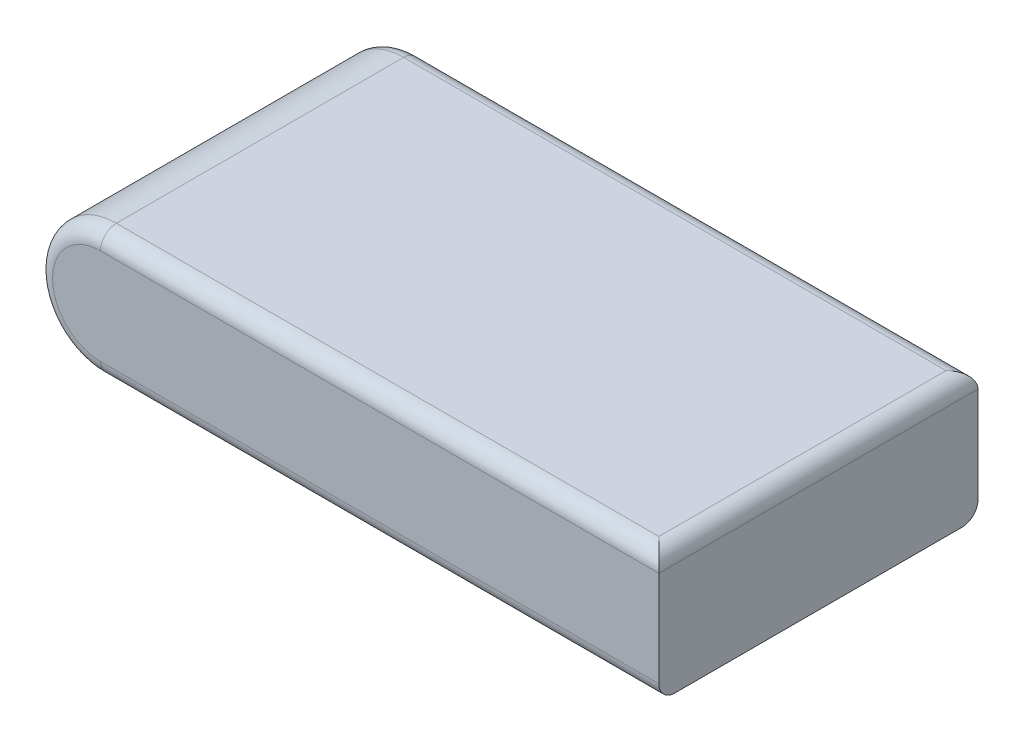
ISO-10303-21;
HEADER;
FILE_DESCRIPTION(('STEP AP214'),'2;1');
FILE_NAME('part.step','',(''),(''),'','','');
FILE_SCHEMA(('AUTOMOTIVE_DESIGN { 1 0 10303 214 1 1 1 1 }'));
ENDSEC;
DATA;
#1=APPLICATION_CONTEXT('core data for automotive mechanical design processes');
#2=APPLICATION_PROTOCOL_DEFINITION('international standard','automotive_design',2000,#1);
#3=PRODUCT_CONTEXT('',#1,'mechanical');
#4=PRODUCT('Part','Part','',(#3));
#5=PRODUCT_RELATED_PRODUCT_CATEGORY('part','',(#4));
#6=PRODUCT_DEFINITION_FORMATION('','',#4);
#7=PRODUCT_DEFINITION_CONTEXT('part definition',#1,'design');
#8=PRODUCT_DEFINITION('design','',#6,#7);
#9=PRODUCT_DEFINITION_SHAPE('','',#8);
#10=(LENGTH_UNIT() NAMED_UNIT(*) SI_UNIT(.MILLI.,.METRE.));
#11=(NAMED_UNIT(*) PLANE_ANGLE_UNIT() SI_UNIT($,.RADIAN.));
#12=(NAMED_UNIT(*) SI_UNIT($,.STERADIAN.) SOLID_ANGLE_UNIT());
#13=UNCERTAINTY_MEASURE_WITH_UNIT(LENGTH_MEASURE(1.E-05),#10,'distance_accuracy_value','');
#14=(GEOMETRIC_REPRESENTATION_CONTEXT(3) GLOBAL_UNCERTAINTY_ASSIGNED_CONTEXT((#13)) GLOBAL_UNIT_ASSIGNED_CONTEXT((#10,
#11,#12)) REPRESENTATION_CONTEXT('',''));
#15=CARTESIAN_POINT('',(0.,0.,0.));
#16=DIRECTION('',(0.,0.,1.));
#17=DIRECTION('',(1.,0.,0.));
#18=AXIS2_PLACEMENT_3D('',#15,#16,#17);
#19=CARTESIAN_POINT('',(-17.5,0.,20.));
#20=DIRECTION('',(0.,0.,-1.));
#21=DIRECTION('',(-1.,0.,0.));
#22=AXIS2_PLACEMENT_3D('',#19,#20,#21);
#23=CYLINDRICAL_SURFACE('',#22,4.);
#24=DIRECTION('',(0.,0.,-1.));
#25=VECTOR('',#24,1.);
#26=CARTESIAN_POINT('',(-17.5,-4.00000000000001,20.));
#27=LINE('',#26,#25);
#28=CARTESIAN_POINT('',(-17.5,-4.00000000000001,19.));
#29=VERTEX_POINT('',#28);
#30=CARTESIAN_POINT('',(-17.5,-4.00000000000001,1.));
#31=VERTEX_POINT('',#30);
#32=EDGE_CURVE('E132',#29,#31,#27,.T.);
#33=ORIENTED_EDGE('',*,*,#32,.F.);
#34=CARTESIAN_POINT('',(-17.5,0.,19.));
#35=DIRECTION('',(0.,0.,-1.));
#36=DIRECTION('',(-1.,0.,0.));
#37=AXIS2_PLACEMENT_3D('',#34,#35,#36);
#38=CIRCLE('',#37,4.);
#39=CARTESIAN_POINT('',(-17.5,3.99999999999999,19.));
#40=VERTEX_POINT('',#39);
#41=EDGE_CURVE('E144',#29,#40,#38,.T.);
#42=ORIENTED_EDGE('',*,*,#41,.T.);
#43=DIRECTION('',(0.,0.,-1.));
#44=VECTOR('',#43,1.);
#45=CARTESIAN_POINT('',(-17.5,3.99999999999999,20.));
#46=LINE('',#45,#44);
#47=CARTESIAN_POINT('',(-17.5,3.99999999999999,1.));
#48=VERTEX_POINT('',#47);
#49=EDGE_CURVE('E123',#40,#48,#46,.T.);
#50=ORIENTED_EDGE('',*,*,#49,.T.);
#51=CARTESIAN_POINT('',(-17.5,0.,1.));
#52=DIRECTION('',(0.,0.,-1.));
#53=DIRECTION('',(-1.,0.,0.));
#54=AXIS2_PLACEMENT_3D('',#51,#52,#53);
#55=CIRCLE('',#54,4.);
#56=EDGE_CURVE('E142',#48,#31,#55,.F.);
#57=ORIENTED_EDGE('',*,*,#56,.T.);
#58=EDGE_LOOP('',(#33,#42,#50,#57));
#59=FACE_BOUND('',#58,.T.);
#60=ADVANCED_FACE('F34',(#59),#23,.T.);
#61=CARTESIAN_POINT('',(17.5,-4.,20.));
#62=DIRECTION('',(0.,1.,0.));
#63=DIRECTION('',(-1.,0.,0.));
#64=AXIS2_PLACEMENT_3D('',#61,#62,#63);
#65=PLANE('',#64);
#66=DIRECTION('',(0.,0.,-1.));
#67=VECTOR('',#66,1.);
#68=CARTESIAN_POINT('',(17.5,-4.,20.));
#69=LINE('',#68,#67);
#70=CARTESIAN_POINT('',(17.5,-4.,19.));
#71=VERTEX_POINT('',#70);
#72=CARTESIAN_POINT('',(17.5,-4.,1.));
#73=VERTEX_POINT('',#72);
#74=EDGE_CURVE('E127',#71,#73,#69,.T.);
#75=ORIENTED_EDGE('',*,*,#74,.F.);
#76=DIRECTION('',(1.,0.,0.));
#77=VECTOR('',#76,1.);
#78=CARTESIAN_POINT('',(17.5,-4.,19.));
#79=LINE('',#78,#77);
#80=EDGE_CURVE('E102',#71,#29,#79,.F.);
#81=ORIENTED_EDGE('',*,*,#80,.T.);
#82=ORIENTED_EDGE('',*,*,#32,.T.);
#83=DIRECTION('',(1.,0.,0.));
#84=VECTOR('',#83,1.);
#85=CARTESIAN_POINT('',(17.5,-4.,1.));
#86=LINE('',#85,#84);
#87=EDGE_CURVE('E107',#31,#73,#86,.T.);
#88=ORIENTED_EDGE('',*,*,#87,.T.);
#89=EDGE_LOOP('',(#75,#81,#82,#88));
#90=FACE_BOUND('',#89,.T.);
#91=ADVANCED_FACE('F181',(#90),#65,.F.);
#92=CARTESIAN_POINT('',(17.5,-4.,20.));
#93=DIRECTION('',(-1.,0.,0.));
#94=DIRECTION('',(0.,0.,1.));
#95=AXIS2_PLACEMENT_3D('',#92,#93,#94);
#96=PLANE('',#95);
#97=DIRECTION('',(0.,1.,0.));
#98=VECTOR('',#97,1.);
#99=CARTESIAN_POINT('',(17.5,-4.,20.));
#100=LINE('',#99,#98);
#101=CARTESIAN_POINT('',(17.5,-3.,20.));
#102=VERTEX_POINT('',#101);
#103=CARTESIAN_POINT('',(17.5,3.,20.));
#104=VERTEX_POINT('',#103);
#105=EDGE_CURVE('E113',#102,#104,#100,.T.);
#106=ORIENTED_EDGE('',*,*,#105,.F.);
#107=CARTESIAN_POINT('',(17.5,-3.,19.));
#108=DIRECTION('',(-1.,0.,0.));
#109=DIRECTION('',(0.,0.,1.));
#110=AXIS2_PLACEMENT_3D('',#107,#108,#109);
#111=CIRCLE('',#110,1.);
#112=EDGE_CURVE('E97',#102,#71,#111,.F.);
#113=ORIENTED_EDGE('',*,*,#112,.T.);
#114=ORIENTED_EDGE('',*,*,#74,.T.);
#115=CARTESIAN_POINT('',(17.5,-3.,1.));
#116=DIRECTION('',(-1.,0.,0.));
#117=DIRECTION('',(0.,0.,1.));
#118=AXIS2_PLACEMENT_3D('',#115,#116,#117);
#119=CIRCLE('',#118,1.);
#120=CARTESIAN_POINT('',(17.5,-3.,0.));
#121=VERTEX_POINT('',#120);
#122=EDGE_CURVE('E108',#73,#121,#119,.F.);
#123=ORIENTED_EDGE('',*,*,#122,.T.);
#124=DIRECTION('',(0.,1.,0.));
#125=VECTOR('',#124,1.);
#126=CARTESIAN_POINT('',(17.5,-4.,0.));
#127=LINE('',#126,#125);
#128=CARTESIAN_POINT('',(17.5,3.,0.));
#129=VERTEX_POINT('',#128);
#130=EDGE_CURVE('E124',#121,#129,#127,.T.);
#131=ORIENTED_EDGE('',*,*,#130,.T.);
#132=DIRECTION('',(0.,0.,-1.));
#133=VECTOR('',#132,1.);
#134=CARTESIAN_POINT('',(17.5,3.,20.));
#135=LINE('',#134,#133);
#136=EDGE_CURVE('E118',#129,#104,#135,.F.);
#137=ORIENTED_EDGE('',*,*,#136,.T.);
#138=EDGE_LOOP('',(#106,#113,#114,#123,#131,#137));
#139=FACE_BOUND('',#138,.T.);
#140=ADVANCED_FACE('F120',(#139),#96,.F.);
#141=CARTESIAN_POINT('',(17.5,4.,20.));
#142=DIRECTION('',(0.,-1.,0.));
#143=DIRECTION('',(1.,0.,0.));
#144=AXIS2_PLACEMENT_3D('',#141,#142,#143);
#145=PLANE('',#144);
#146=ORIENTED_EDGE('',*,*,#49,.F.);
#147=DIRECTION('',(-1.,0.,0.));
#148=VECTOR('',#147,1.);
#149=CARTESIAN_POINT('',(17.5,4.,19.));
#150=LINE('',#149,#148);
#151=CARTESIAN_POINT('',(16.5,4.,19.));
#152=VERTEX_POINT('',#151);
#153=EDGE_CURVE('E11',#40,#152,#150,.F.);
#154=ORIENTED_EDGE('',*,*,#153,.T.);
#155=DIRECTION('',(0.,0.,-1.));
#156=VECTOR('',#155,1.);
#157=CARTESIAN_POINT('',(16.5,4.,20.));
#158=LINE('',#157,#156);
#159=CARTESIAN_POINT('',(16.5,4.,1.));
#160=VERTEX_POINT('',#159);
#161=EDGE_CURVE('E43',#152,#160,#158,.T.);
#162=ORIENTED_EDGE('',*,*,#161,.T.);
#163=DIRECTION('',(-1.,0.,0.));
#164=VECTOR('',#163,1.);
#165=CARTESIAN_POINT('',(-17.5,3.99999999999999,1.));
#166=LINE('',#165,#164);
#167=EDGE_CURVE('E152',#160,#48,#166,.T.);
#168=ORIENTED_EDGE('',*,*,#167,.T.);
#169=EDGE_LOOP('',(#146,#154,#162,#168));
#170=FACE_BOUND('',#169,.T.);
#171=ADVANCED_FACE('F198',(#170),#145,.F.);
#172=CARTESIAN_POINT('',(-17.5,0.,20.));
#173=DIRECTION('',(0.,0.,-1.));
#174=DIRECTION('',(-1.,0.,0.));
#175=AXIS2_PLACEMENT_3D('',#172,#173,#174);
#176=PLANE('',#175);
#177=CARTESIAN_POINT('',(-17.5,0.,20.));
#178=DIRECTION('',(0.,0.,-1.));
#179=DIRECTION('',(-1.,0.,0.));
#180=AXIS2_PLACEMENT_3D('',#177,#178,#179);
#181=CIRCLE('',#180,3.);
#182=CARTESIAN_POINT('',(-17.5,2.99999999999999,20.));
#183=VERTEX_POINT('',#182);
#184=CARTESIAN_POINT('',(-17.5,-3.00000000000001,20.));
#185=VERTEX_POINT('',#184);
#186=EDGE_CURVE('E116',#183,#185,#181,.F.);
#187=ORIENTED_EDGE('',*,*,#186,.T.);
#188=DIRECTION('',(1.,0.,0.));
#189=VECTOR('',#188,1.);
#190=CARTESIAN_POINT('',(-17.5,-3.00000000000001,20.));
#191=LINE('',#190,#189);
#192=EDGE_CURVE('E101',#185,#102,#191,.T.);
#193=ORIENTED_EDGE('',*,*,#192,.T.);
#194=ORIENTED_EDGE('',*,*,#105,.T.);
#195=DIRECTION('',(-1.,0.,0.));
#196=VECTOR('',#195,1.);
#197=CARTESIAN_POINT('',(-17.5,2.99999999999999,20.));
#198=LINE('',#197,#196);
#199=EDGE_CURVE('E135',#104,#183,#198,.T.);
#200=ORIENTED_EDGE('',*,*,#199,.T.);
#201=EDGE_LOOP('',(#187,#193,#194,#200));
#202=FACE_BOUND('',#201,.T.);
#203=ADVANCED_FACE('F112',(#202),#176,.F.);
#204=CARTESIAN_POINT('',(-17.5,0.,0.));
#205=DIRECTION('',(0.,0.,-1.));
#206=DIRECTION('',(-1.,0.,0.));
#207=AXIS2_PLACEMENT_3D('',#204,#205,#206);
#208=PLANE('',#207);
#209=ORIENTED_EDGE('',*,*,#130,.F.);
#210=DIRECTION('',(1.,0.,0.));
#211=VECTOR('',#210,1.);
#212=CARTESIAN_POINT('',(-17.5,-3.00000000000001,0.));
#213=LINE('',#212,#211);
#214=CARTESIAN_POINT('',(-17.5,-3.00000000000001,0.));
#215=VERTEX_POINT('',#214);
#216=EDGE_CURVE('E150',#121,#215,#213,.F.);
#217=ORIENTED_EDGE('',*,*,#216,.T.);
#218=CARTESIAN_POINT('',(-17.5,0.,0.));
#219=DIRECTION('',(0.,0.,-1.));
#220=DIRECTION('',(-1.,0.,0.));
#221=AXIS2_PLACEMENT_3D('',#218,#219,#220);
#222=CIRCLE('',#221,3.);
#223=CARTESIAN_POINT('',(-17.5,2.99999999999999,0.));
#224=VERTEX_POINT('',#223);
#225=EDGE_CURVE('E148',#215,#224,#222,.T.);
#226=ORIENTED_EDGE('',*,*,#225,.T.);
#227=DIRECTION('',(-1.,0.,0.));
#228=VECTOR('',#227,1.);
#229=CARTESIAN_POINT('',(17.5,3.,0.));
#230=LINE('',#229,#228);
#231=EDGE_CURVE('E146',#224,#129,#230,.F.);
#232=ORIENTED_EDGE('',*,*,#231,.T.);
#233=EDGE_LOOP('',(#209,#217,#226,#232));
#234=FACE_BOUND('',#233,.T.);
#235=ADVANCED_FACE('F186',(#234),#208,.T.);
#236=CARTESIAN_POINT('',(17.5,-3.,1.));
#237=DIRECTION('',(-1.,0.,0.));
#238=DIRECTION('',(0.,-1.,0.));
#239=AXIS2_PLACEMENT_3D('',#236,#237,#238);
#240=CYLINDRICAL_SURFACE('',#239,1.);
#241=ORIENTED_EDGE('',*,*,#122,.F.);
#242=ORIENTED_EDGE('',*,*,#87,.F.);
#243=CARTESIAN_POINT('',(-17.5,-3.00000000000001,1.));
#244=DIRECTION('',(-1.,0.,0.));
#245=DIRECTION('',(0.,0.,1.));
#246=AXIS2_PLACEMENT_3D('',#243,#244,#245);
#247=CIRCLE('',#246,1.);
#248=EDGE_CURVE('E38',#215,#31,#247,.T.);
#249=ORIENTED_EDGE('',*,*,#248,.F.);
#250=ORIENTED_EDGE('',*,*,#216,.F.);
#251=EDGE_LOOP('',(#241,#242,#249,#250));
#252=FACE_BOUND('',#251,.T.);
#253=ADVANCED_FACE('F36',(#252),#240,.T.);
#254=CARTESIAN_POINT('',(-17.5,0.,1.));
#255=DIRECTION('',(0.,0.,-1.));
#256=DIRECTION('',(-1.,0.,0.));
#257=AXIS2_PLACEMENT_3D('',#254,#255,#256);
#258=TOROIDAL_SURFACE('',#257,3.,1.);
#259=ORIENTED_EDGE('',*,*,#248,.T.);
#260=ORIENTED_EDGE('',*,*,#56,.F.);
#261=CARTESIAN_POINT('',(-17.5,3.,1.));
#262=DIRECTION('',(1.,0.,0.));
#263=DIRECTION('',(0.,0.,-1.));
#264=AXIS2_PLACEMENT_3D('',#261,#262,#263);
#265=CIRCLE('',#264,1.);
#266=EDGE_CURVE('E165',#224,#48,#265,.T.);
#267=ORIENTED_EDGE('',*,*,#266,.F.);
#268=ORIENTED_EDGE('',*,*,#225,.F.);
#269=EDGE_LOOP('',(#259,#260,#267,#268));
#270=FACE_BOUND('',#269,.T.);
#271=ADVANCED_FACE('F175',(#270),#258,.T.);
#272=CARTESIAN_POINT('',(17.5,3.,1.));
#273=DIRECTION('',(1.,0.,0.));
#274=DIRECTION('',(0.,1.,0.));
#275=AXIS2_PLACEMENT_3D('',#272,#273,#274);
#276=CYLINDRICAL_SURFACE('',#275,1.);
#277=ORIENTED_EDGE('',*,*,#266,.T.);
#278=ORIENTED_EDGE('',*,*,#167,.F.);
#279=CARTESIAN_POINT('',(16.5,3.,1.));
#280=DIRECTION('',(0.707106781186547,0.,0.707106781186547));
#281=DIRECTION('',(0.707106781186547,0.,-0.707106781186547));
#282=AXIS2_PLACEMENT_3D('',#279,#280,#281);
#283=ELLIPSE('',#282,1.41421356237309,1.);
#284=EDGE_CURVE('E163',#129,#160,#283,.T.);
#285=ORIENTED_EDGE('',*,*,#284,.F.);
#286=ORIENTED_EDGE('',*,*,#231,.F.);
#287=EDGE_LOOP('',(#277,#278,#285,#286));
#288=FACE_BOUND('',#287,.T.);
#289=ADVANCED_FACE('F187',(#288),#276,.T.);
#290=CARTESIAN_POINT('',(16.5,3.,20.));
#291=DIRECTION('',(0.,0.,-1.));
#292=DIRECTION('',(-1.,0.,0.));
#293=AXIS2_PLACEMENT_3D('',#290,#291,#292);
#294=CYLINDRICAL_SURFACE('',#293,1.);
#295=ORIENTED_EDGE('',*,*,#284,.T.);
#296=ORIENTED_EDGE('',*,*,#161,.F.);
#297=CARTESIAN_POINT('',(16.5,3.,19.));
#298=DIRECTION('',(-0.707106781186547,0.,0.707106781186547));
#299=DIRECTION('',(-0.707106781186547,0.,-0.707106781186547));
#300=AXIS2_PLACEMENT_3D('',#297,#298,#299);
#301=ELLIPSE('',#300,1.41421356237309,1.);
#302=EDGE_CURVE('E160',#104,#152,#301,.T.);
#303=ORIENTED_EDGE('',*,*,#302,.F.);
#304=ORIENTED_EDGE('',*,*,#136,.F.);
#305=EDGE_LOOP('',(#295,#296,#303,#304));
#306=FACE_BOUND('',#305,.T.);
#307=ADVANCED_FACE('F189',(#306),#294,.T.);
#308=CARTESIAN_POINT('',(-17.5,2.99999999999999,19.));
#309=DIRECTION('',(-1.,0.,0.));
#310=DIRECTION('',(0.,-1.,0.));
#311=AXIS2_PLACEMENT_3D('',#308,#309,#310);
#312=CYLINDRICAL_SURFACE('',#311,1.);
#313=ORIENTED_EDGE('',*,*,#302,.T.);
#314=ORIENTED_EDGE('',*,*,#153,.F.);
#315=CARTESIAN_POINT('',(-17.5,2.99999999999999,19.));
#316=DIRECTION('',(-1.,0.,0.));
#317=DIRECTION('',(0.,0.,1.));
#318=AXIS2_PLACEMENT_3D('',#315,#316,#317);
#319=CIRCLE('',#318,1.);
#320=EDGE_CURVE('E157',#183,#40,#319,.T.);
#321=ORIENTED_EDGE('',*,*,#320,.F.);
#322=ORIENTED_EDGE('',*,*,#199,.F.);
#323=EDGE_LOOP('',(#313,#314,#321,#322));
#324=FACE_BOUND('',#323,.T.);
#325=ADVANCED_FACE('F193',(#324),#312,.T.);
#326=CARTESIAN_POINT('',(-17.5,0.,19.));
#327=DIRECTION('',(0.,0.,-1.));
#328=DIRECTION('',(-1.,0.,0.));
#329=AXIS2_PLACEMENT_3D('',#326,#327,#328);
#330=TOROIDAL_SURFACE('',#329,3.,1.);
#331=ORIENTED_EDGE('',*,*,#320,.T.);
#332=ORIENTED_EDGE('',*,*,#41,.F.);
#333=CARTESIAN_POINT('',(-17.5,-3.00000000000001,19.));
#334=DIRECTION('',(1.,0.,0.));
#335=DIRECTION('',(0.,0.,-1.));
#336=AXIS2_PLACEMENT_3D('',#333,#334,#335);
#337=CIRCLE('',#336,1.);
#338=EDGE_CURVE('E155',#185,#29,#337,.T.);
#339=ORIENTED_EDGE('',*,*,#338,.F.);
#340=ORIENTED_EDGE('',*,*,#186,.F.);
#341=EDGE_LOOP('',(#331,#332,#339,#340));
#342=FACE_BOUND('',#341,.T.);
#343=ADVANCED_FACE('F196',(#342),#330,.T.);
#344=CARTESIAN_POINT('',(-17.5,-3.00000000000001,19.));
#345=DIRECTION('',(1.,0.,0.));
#346=DIRECTION('',(0.,1.,0.));
#347=AXIS2_PLACEMENT_3D('',#344,#345,#346);
#348=CYLINDRICAL_SURFACE('',#347,1.);
#349=ORIENTED_EDGE('',*,*,#338,.T.);
#350=ORIENTED_EDGE('',*,*,#80,.F.);
#351=ORIENTED_EDGE('',*,*,#112,.F.);
#352=ORIENTED_EDGE('',*,*,#192,.F.);
#353=EDGE_LOOP('',(#349,#350,#351,#352));
#354=FACE_BOUND('',#353,.T.);
#355=ADVANCED_FACE('F100',(#354),#348,.T.);
#356=CLOSED_SHELL('',(#60,#91,#140,#171,#203,#235,#253,#271,#289,#307,#325,#343,#355));
#357=MANIFOLD_SOLID_BREP('B2',#356);
#358=ADVANCED_BREP_SHAPE_REPRESENTATION('',(#18,#357),#14);
#359=SHAPE_DEFINITION_REPRESENTATION(#9,#358);
ENDSEC;
END-ISO-10303-21;
